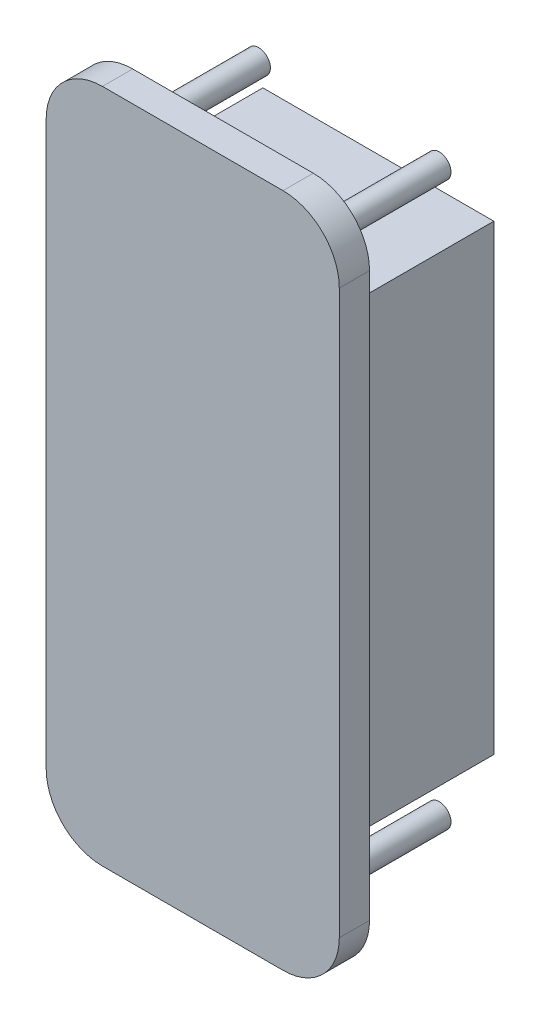
ISO-10303-21;
HEADER;
FILE_DESCRIPTION(('STEP AP214'),'2;1');
FILE_NAME('part.step','',(''),(''),'','','');
FILE_SCHEMA(('AUTOMOTIVE_DESIGN { 1 0 10303 214 1 1 1 1 }'));
ENDSEC;
DATA;
#1=APPLICATION_CONTEXT('core data for automotive mechanical design processes');
#2=APPLICATION_PROTOCOL_DEFINITION('international standard','automotive_design',2000,#1);
#3=PRODUCT_CONTEXT('',#1,'mechanical');
#4=PRODUCT('Part','Part','',(#3));
#5=PRODUCT_RELATED_PRODUCT_CATEGORY('part','',(#4));
#6=PRODUCT_DEFINITION_FORMATION('','',#4);
#7=PRODUCT_DEFINITION_CONTEXT('part definition',#1,'design');
#8=PRODUCT_DEFINITION('design','',#6,#7);
#9=PRODUCT_DEFINITION_SHAPE('','',#8);
#10=(LENGTH_UNIT() NAMED_UNIT(*) SI_UNIT(.MILLI.,.METRE.));
#11=(NAMED_UNIT(*) PLANE_ANGLE_UNIT() SI_UNIT($,.RADIAN.));
#12=(NAMED_UNIT(*) SI_UNIT($,.STERADIAN.) SOLID_ANGLE_UNIT());
#13=UNCERTAINTY_MEASURE_WITH_UNIT(LENGTH_MEASURE(1.E-05),#10,'distance_accuracy_value','');
#14=(GEOMETRIC_REPRESENTATION_CONTEXT(3) GLOBAL_UNCERTAINTY_ASSIGNED_CONTEXT((#13)) GLOBAL_UNIT_ASSIGNED_CONTEXT((#10,
#11,#12)) REPRESENTATION_CONTEXT('',''));
#15=CARTESIAN_POINT('',(0.,0.,0.));
#16=DIRECTION('',(0.,0.,1.));
#17=DIRECTION('',(1.,0.,0.));
#18=AXIS2_PLACEMENT_3D('',#15,#16,#17);
#19=CARTESIAN_POINT('',(-13.7499999999591,-291545.,61.891869381217));
#20=DIRECTION('',(1.,0.,0.));
#21=DIRECTION('',(0.,1.,0.));
#22=AXIS2_PLACEMENT_3D('',#19,#20,#21);
#23=PLANE('',#22);
#24=DIRECTION('',(0.,-1.,0.));
#25=VECTOR('',#24,1.);
#26=CARTESIAN_POINT('',(-13.7499999999591,-291545.,0.399999999999998));
#27=LINE('',#26,#25);
#28=CARTESIAN_POINT('',(-13.7500000000159,27.4999999999686,0.399999999999998));
#29=VERTEX_POINT('',#28);
#30=CARTESIAN_POINT('',(-13.7500000000159,-27.4999999999686,0.399999999999998));
#31=VERTEX_POINT('',#30);
#32=EDGE_CURVE('E227',#29,#31,#27,.T.);
#33=ORIENTED_EDGE('',*,*,#32,.F.);
#34=DIRECTION('',(0.,0.,-1.));
#35=VECTOR('',#34,1.);
#36=CARTESIAN_POINT('',(-13.7500000000159,27.4999999999686,61.891869381217));
#37=LINE('',#36,#35);
#38=CARTESIAN_POINT('',(-13.7500000000159,27.4999999999686,-18.1));
#39=VERTEX_POINT('',#38);
#40=EDGE_CURVE('E49',#29,#39,#37,.T.);
#41=ORIENTED_EDGE('',*,*,#40,.T.);
#42=DIRECTION('',(0.,-1.,0.));
#43=VECTOR('',#42,1.);
#44=CARTESIAN_POINT('',(-13.7499999999591,-291545.,-18.1));
#45=LINE('',#44,#43);
#46=CARTESIAN_POINT('',(-13.7500000000159,-27.4999999999686,-18.1));
#47=VERTEX_POINT('',#46);
#48=EDGE_CURVE('E219',#39,#47,#45,.T.);
#49=ORIENTED_EDGE('',*,*,#48,.T.);
#50=DIRECTION('',(0.,0.,-1.));
#51=VECTOR('',#50,1.);
#52=CARTESIAN_POINT('',(-13.7500000000159,-27.4999999999686,61.891869381217));
#53=LINE('',#52,#51);
#54=EDGE_CURVE('E70',#31,#47,#53,.T.);
#55=ORIENTED_EDGE('',*,*,#54,.F.);
#56=EDGE_LOOP('',(#33,#41,#49,#55));
#57=FACE_BOUND('',#56,.T.);
#58=ADVANCED_FACE('F35',(#57),#23,.F.);
#59=CARTESIAN_POINT('',(-400000.,-27.4999999999181,61.891869381217));
#60=DIRECTION('',(0.,1.,0.));
#61=DIRECTION('',(-1.,0.,0.));
#62=AXIS2_PLACEMENT_3D('',#59,#60,#61);
#63=PLANE('',#62);
#64=DIRECTION('',(1.,0.,0.));
#65=VECTOR('',#64,1.);
#66=CARTESIAN_POINT('',(-400000.,-27.4999999999181,0.399999999999998));
#67=LINE('',#66,#65);
#68=CARTESIAN_POINT('',(13.750000000036,-27.499999999975,0.399999999999998));
#69=VERTEX_POINT('',#68);
#70=EDGE_CURVE('E76',#31,#69,#67,.T.);
#71=ORIENTED_EDGE('',*,*,#70,.F.);
#72=ORIENTED_EDGE('',*,*,#54,.T.);
#73=DIRECTION('',(1.,0.,0.));
#74=VECTOR('',#73,1.);
#75=CARTESIAN_POINT('',(-400000.,-27.4999999999181,-18.1));
#76=LINE('',#75,#74);
#77=CARTESIAN_POINT('',(13.750000000036,-27.499999999975,-18.1));
#78=VERTEX_POINT('',#77);
#79=EDGE_CURVE('E217',#47,#78,#76,.T.);
#80=ORIENTED_EDGE('',*,*,#79,.T.);
#81=DIRECTION('',(0.,0.,-1.));
#82=VECTOR('',#81,1.);
#83=CARTESIAN_POINT('',(13.750000000036,-27.499999999975,61.891869381217));
#84=LINE('',#83,#82);
#85=EDGE_CURVE('E216',#69,#78,#84,.T.);
#86=ORIENTED_EDGE('',*,*,#85,.F.);
#87=EDGE_LOOP('',(#71,#72,#80,#86));
#88=FACE_BOUND('',#87,.T.);
#89=ADVANCED_FACE('F276',(#88),#63,.F.);
#90=CARTESIAN_POINT('',(13.7500000000728,-291545.,61.891869381217));
#91=DIRECTION('',(-1.,0.,0.));
#92=DIRECTION('',(0.,-1.,0.));
#93=AXIS2_PLACEMENT_3D('',#90,#91,#92);
#94=PLANE('',#93);
#95=DIRECTION('',(0.,1.,0.));
#96=VECTOR('',#95,1.);
#97=CARTESIAN_POINT('',(13.7500000000728,-291545.,0.399999999999998));
#98=LINE('',#97,#96);
#99=CARTESIAN_POINT('',(13.7500000000159,27.4999999999686,0.399999999999998));
#100=VERTEX_POINT('',#99);
#101=EDGE_CURVE('E222',#69,#100,#98,.T.);
#102=ORIENTED_EDGE('',*,*,#101,.F.);
#103=ORIENTED_EDGE('',*,*,#85,.T.);
#104=DIRECTION('',(0.,1.,0.));
#105=VECTOR('',#104,1.);
#106=CARTESIAN_POINT('',(13.7500000000728,-291545.,-18.1));
#107=LINE('',#106,#105);
#108=CARTESIAN_POINT('',(13.7500000000159,27.4999999999686,-18.1));
#109=VERTEX_POINT('',#108);
#110=EDGE_CURVE('E214',#78,#109,#107,.T.);
#111=ORIENTED_EDGE('',*,*,#110,.T.);
#112=DIRECTION('',(0.,0.,-1.));
#113=VECTOR('',#112,1.);
#114=CARTESIAN_POINT('',(13.7500000000159,27.4999999999686,61.891869381217));
#115=LINE('',#114,#113);
#116=EDGE_CURVE('E55',#100,#109,#115,.T.);
#117=ORIENTED_EDGE('',*,*,#116,.F.);
#118=EDGE_LOOP('',(#102,#103,#111,#117));
#119=FACE_BOUND('',#118,.T.);
#120=ADVANCED_FACE('F281',(#119),#94,.F.);
#121=CARTESIAN_POINT('',(-400000.,27.4999999999181,61.891869381217));
#122=DIRECTION('',(0.,-1.,0.));
#123=DIRECTION('',(1.,0.,0.));
#124=AXIS2_PLACEMENT_3D('',#121,#122,#123);
#125=PLANE('',#124);
#126=DIRECTION('',(-1.,0.,0.));
#127=VECTOR('',#126,1.);
#128=CARTESIAN_POINT('',(-400000.,27.4999999999181,0.399999999999998));
#129=LINE('',#128,#127);
#130=EDGE_CURVE('E213',#100,#29,#129,.T.);
#131=ORIENTED_EDGE('',*,*,#130,.F.);
#132=ORIENTED_EDGE('',*,*,#116,.T.);
#133=DIRECTION('',(-1.,0.,0.));
#134=VECTOR('',#133,1.);
#135=CARTESIAN_POINT('',(-400000.,27.4999999999181,-18.1));
#136=LINE('',#135,#134);
#137=EDGE_CURVE('E211',#109,#39,#136,.T.);
#138=ORIENTED_EDGE('',*,*,#137,.T.);
#139=ORIENTED_EDGE('',*,*,#40,.F.);
#140=EDGE_LOOP('',(#131,#132,#138,#139));
#141=FACE_BOUND('',#140,.T.);
#142=ADVANCED_FACE('F282',(#141),#125,.F.);
#143=CARTESIAN_POINT('',(0.,0.,-18.1));
#144=DIRECTION('',(0.,0.,1.));
#145=DIRECTION('',(1.,0.,0.));
#146=AXIS2_PLACEMENT_3D('',#143,#144,#145);
#147=PLANE('',#146);
#148=ORIENTED_EDGE('',*,*,#48,.F.);
#149=ORIENTED_EDGE('',*,*,#137,.F.);
#150=ORIENTED_EDGE('',*,*,#110,.F.);
#151=ORIENTED_EDGE('',*,*,#79,.F.);
#152=EDGE_LOOP('',(#148,#149,#150,#151));
#153=FACE_BOUND('',#152,.T.);
#154=ADVANCED_FACE('F248',(#153),#147,.F.);
#155=CARTESIAN_POINT('',(0.,0.,0.4));
#156=DIRECTION('',(0.,0.,1.));
#157=DIRECTION('',(1.,0.,0.));
#158=AXIS2_PLACEMENT_3D('',#155,#156,#157);
#159=PLANE('',#158);
#160=CARTESIAN_POINT('',(-10.75,33.5,0.4));
#161=DIRECTION('',(0.,0.,1.));
#162=DIRECTION('',(1.,0.,0.));
#163=AXIS2_PLACEMENT_3D('',#160,#161,#162);
#164=CIRCLE('',#163,1.4);
#165=CARTESIAN_POINT('',(-12.15,33.5,0.4));
#166=VERTEX_POINT('',#165);
#167=EDGE_CURVE('E11',#166,#166,#164,.F.);
#168=ORIENTED_EDGE('',*,*,#167,.F.);
#169=EDGE_LOOP('',(#168));
#170=FACE_BOUND('',#169,.T.);
#171=CARTESIAN_POINT('',(-10.75,-33.5,0.4));
#172=DIRECTION('',(0.,0.,1.));
#173=DIRECTION('',(1.,0.,0.));
#174=AXIS2_PLACEMENT_3D('',#171,#172,#173);
#175=CIRCLE('',#174,1.4);
#176=CARTESIAN_POINT('',(-12.15,-33.5,0.4));
#177=VERTEX_POINT('',#176);
#178=EDGE_CURVE('E42',#177,#177,#175,.F.);
#179=ORIENTED_EDGE('',*,*,#178,.F.);
#180=EDGE_LOOP('',(#179));
#181=FACE_BOUND('',#180,.T.);
#182=CARTESIAN_POINT('',(10.75,33.5,0.4));
#183=DIRECTION('',(0.,0.,1.));
#184=DIRECTION('',(1.,0.,0.));
#185=AXIS2_PLACEMENT_3D('',#182,#183,#184);
#186=CIRCLE('',#185,1.4);
#187=CARTESIAN_POINT('',(9.35,33.5,0.4));
#188=VERTEX_POINT('',#187);
#189=EDGE_CURVE('E238',#188,#188,#186,.F.);
#190=ORIENTED_EDGE('',*,*,#189,.F.);
#191=EDGE_LOOP('',(#190));
#192=FACE_BOUND('',#191,.T.);
#193=CARTESIAN_POINT('',(10.75,-33.5,0.4));
#194=DIRECTION('',(0.,0.,1.));
#195=DIRECTION('',(1.,0.,0.));
#196=AXIS2_PLACEMENT_3D('',#193,#194,#195);
#197=CIRCLE('',#196,1.4);
#198=CARTESIAN_POINT('',(9.35,-33.5,0.4));
#199=VERTEX_POINT('',#198);
#200=EDGE_CURVE('E225',#199,#199,#197,.F.);
#201=ORIENTED_EDGE('',*,*,#200,.F.);
#202=EDGE_LOOP('',(#201));
#203=FACE_BOUND('',#202,.T.);
#204=DIRECTION('',(1.,0.,0.));
#205=VECTOR('',#204,1.);
#206=CARTESIAN_POINT('',(-400000.,40.1999999998618,0.399999999999998));
#207=LINE('',#206,#205);
#208=CARTESIAN_POINT('',(-10.7500000000335,40.2,0.400000000000025));
#209=VERTEX_POINT('',#208);
#210=CARTESIAN_POINT('',(10.75000000003,40.1999999999909,0.400000000000025));
#211=VERTEX_POINT('',#210);
#212=EDGE_CURVE('E135',#209,#211,#207,.T.);
#213=ORIENTED_EDGE('',*,*,#212,.T.);
#214=CARTESIAN_POINT('',(10.75,33.5,0.399999999999998));
#215=DIRECTION('',(0.,0.,1.));
#216=DIRECTION('',(1.,0.,0.));
#217=AXIS2_PLACEMENT_3D('',#214,#215,#216);
#218=CIRCLE('',#217,6.7);
#219=CARTESIAN_POINT('',(17.45,33.5000000000041,0.400000000000025));
#220=VERTEX_POINT('',#219);
#221=EDGE_CURVE('E196',#220,#211,#218,.T.);
#222=ORIENTED_EDGE('',*,*,#221,.F.);
#223=DIRECTION('',(0.,-1.,0.));
#224=VECTOR('',#223,1.);
#225=CARTESIAN_POINT('',(17.4500000000587,-291545.,0.399999999999998));
#226=LINE('',#225,#224);
#227=CARTESIAN_POINT('',(17.4500000000285,-33.5000000000036,0.400000000000025));
#228=VERTEX_POINT('',#227);
#229=EDGE_CURVE('E193',#220,#228,#226,.T.);
#230=ORIENTED_EDGE('',*,*,#229,.T.);
#231=CARTESIAN_POINT('',(10.75,-33.5,0.399999999999998));
#232=DIRECTION('',(0.,0.,1.));
#233=DIRECTION('',(1.,0.,0.));
#234=AXIS2_PLACEMENT_3D('',#231,#232,#233);
#235=CIRCLE('',#234,6.69999999999999);
#236=CARTESIAN_POINT('',(10.74999999997,-40.2,0.400000000000025));
#237=VERTEX_POINT('',#236);
#238=EDGE_CURVE('E190',#237,#228,#235,.T.);
#239=ORIENTED_EDGE('',*,*,#238,.F.);
#240=DIRECTION('',(-1.,0.,0.));
#241=VECTOR('',#240,1.);
#242=CARTESIAN_POINT('',(-400000.,-40.2000000000891,0.399999999999998));
#243=LINE('',#242,#241);
#244=CARTESIAN_POINT('',(-10.75000000003,-40.19999999996,0.400000000000025));
#245=VERTEX_POINT('',#244);
#246=EDGE_CURVE('E186',#237,#245,#243,.T.);
#247=ORIENTED_EDGE('',*,*,#246,.T.);
#248=CARTESIAN_POINT('',(-10.75,-33.5,0.399999999999998));
#249=DIRECTION('',(0.,0.,1.));
#250=DIRECTION('',(1.,0.,0.));
#251=AXIS2_PLACEMENT_3D('',#248,#249,#250);
#252=CIRCLE('',#251,6.7);
#253=CARTESIAN_POINT('',(-17.45,-33.5000000000041,0.400000000000025));
#254=VERTEX_POINT('',#253);
#255=EDGE_CURVE('E183',#254,#245,#252,.T.);
#256=ORIENTED_EDGE('',*,*,#255,.F.);
#257=DIRECTION('',(0.,1.,0.));
#258=VECTOR('',#257,1.);
#259=CARTESIAN_POINT('',(-17.449999999945,-291545.,0.399999999999998));
#260=LINE('',#259,#258);
#261=CARTESIAN_POINT('',(-17.4499999999752,33.5000000000036,0.400000000000025));
#262=VERTEX_POINT('',#261);
#263=EDGE_CURVE('E138',#254,#262,#260,.T.);
#264=ORIENTED_EDGE('',*,*,#263,.T.);
#265=CARTESIAN_POINT('',(-10.75,33.5,0.399999999999998));
#266=DIRECTION('',(0.,0.,1.));
#267=DIRECTION('',(1.,0.,0.));
#268=AXIS2_PLACEMENT_3D('',#265,#266,#267);
#269=CIRCLE('',#268,6.7);
#270=EDGE_CURVE('E130',#209,#262,#269,.T.);
#271=ORIENTED_EDGE('',*,*,#270,.F.);
#272=EDGE_LOOP('',(#213,#222,#230,#239,#247,#256,#264,#271));
#273=FACE_BOUND('',#272,.T.);
#274=ORIENTED_EDGE('',*,*,#101,.T.);
#275=ORIENTED_EDGE('',*,*,#130,.T.);
#276=ORIENTED_EDGE('',*,*,#32,.T.);
#277=ORIENTED_EDGE('',*,*,#70,.T.);
#278=EDGE_LOOP('',(#274,#275,#276,#277));
#279=FACE_BOUND('',#278,.T.);
#280=ADVANCED_FACE('F132',(#170,#181,#192,#203,#273,#279),#159,.F.);
#281=CARTESIAN_POINT('',(0.,0.,4.));
#282=DIRECTION('',(0.,0.,1.));
#283=DIRECTION('',(1.,0.,0.));
#284=AXIS2_PLACEMENT_3D('',#281,#282,#283);
#285=PLANE('',#284);
#286=DIRECTION('',(1.,0.,0.));
#287=VECTOR('',#286,1.);
#288=CARTESIAN_POINT('',(-400000.,40.1999999998618,4.));
#289=LINE('',#288,#287);
#290=CARTESIAN_POINT('',(-10.7500000000335,40.2,4.00000000000003));
#291=VERTEX_POINT('',#290);
#292=CARTESIAN_POINT('',(10.75000000003,40.1999999999909,4.00000000000003));
#293=VERTEX_POINT('',#292);
#294=EDGE_CURVE('E151',#291,#293,#289,.T.);
#295=ORIENTED_EDGE('',*,*,#294,.F.);
#296=CARTESIAN_POINT('',(-10.75,33.5,4.));
#297=DIRECTION('',(0.,0.,1.));
#298=DIRECTION('',(1.,0.,0.));
#299=AXIS2_PLACEMENT_3D('',#296,#297,#298);
#300=CIRCLE('',#299,6.7);
#301=CARTESIAN_POINT('',(-17.4499999999752,33.5000000000036,4.00000000000003));
#302=VERTEX_POINT('',#301);
#303=EDGE_CURVE('E156',#291,#302,#300,.T.);
#304=ORIENTED_EDGE('',*,*,#303,.T.);
#305=DIRECTION('',(0.,1.,0.));
#306=VECTOR('',#305,1.);
#307=CARTESIAN_POINT('',(-17.449999999945,-291545.,4.));
#308=LINE('',#307,#306);
#309=CARTESIAN_POINT('',(-17.45,-33.5000000000041,4.00000000000003));
#310=VERTEX_POINT('',#309);
#311=EDGE_CURVE('E142',#310,#302,#308,.T.);
#312=ORIENTED_EDGE('',*,*,#311,.F.);
#313=CARTESIAN_POINT('',(-10.75,-33.5,4.));
#314=DIRECTION('',(0.,0.,1.));
#315=DIRECTION('',(1.,0.,0.));
#316=AXIS2_PLACEMENT_3D('',#313,#314,#315);
#317=CIRCLE('',#316,6.7);
#318=CARTESIAN_POINT('',(-10.75000000003,-40.19999999996,4.00000000000003));
#319=VERTEX_POINT('',#318);
#320=EDGE_CURVE('E182',#310,#319,#317,.T.);
#321=ORIENTED_EDGE('',*,*,#320,.T.);
#322=DIRECTION('',(-1.,0.,0.));
#323=VECTOR('',#322,1.);
#324=CARTESIAN_POINT('',(-400000.,-40.2000000000891,4.));
#325=LINE('',#324,#323);
#326=CARTESIAN_POINT('',(10.74999999997,-40.2,4.00000000000003));
#327=VERTEX_POINT('',#326);
#328=EDGE_CURVE('E185',#327,#319,#325,.T.);
#329=ORIENTED_EDGE('',*,*,#328,.F.);
#330=CARTESIAN_POINT('',(10.75,-33.5,4.));
#331=DIRECTION('',(0.,0.,1.));
#332=DIRECTION('',(1.,0.,0.));
#333=AXIS2_PLACEMENT_3D('',#330,#331,#332);
#334=CIRCLE('',#333,6.69999999999999);
#335=CARTESIAN_POINT('',(17.4500000000285,-33.5000000000036,4.00000000000003));
#336=VERTEX_POINT('',#335);
#337=EDGE_CURVE('E189',#327,#336,#334,.T.);
#338=ORIENTED_EDGE('',*,*,#337,.T.);
#339=DIRECTION('',(0.,-1.,0.));
#340=VECTOR('',#339,1.);
#341=CARTESIAN_POINT('',(17.4500000000587,-291545.,4.));
#342=LINE('',#341,#340);
#343=CARTESIAN_POINT('',(17.45,33.5000000000041,4.00000000000003));
#344=VERTEX_POINT('',#343);
#345=EDGE_CURVE('E192',#344,#336,#342,.T.);
#346=ORIENTED_EDGE('',*,*,#345,.F.);
#347=CARTESIAN_POINT('',(10.75,33.5,4.));
#348=DIRECTION('',(0.,0.,1.));
#349=DIRECTION('',(1.,0.,0.));
#350=AXIS2_PLACEMENT_3D('',#347,#348,#349);
#351=CIRCLE('',#350,6.7);
#352=EDGE_CURVE('E150',#344,#293,#351,.T.);
#353=ORIENTED_EDGE('',*,*,#352,.T.);
#354=EDGE_LOOP('',(#295,#304,#312,#321,#329,#338,#346,#353));
#355=FACE_BOUND('',#354,.T.);
#356=ADVANCED_FACE('F247',(#355),#285,.T.);
#357=CARTESIAN_POINT('',(10.75,33.5,89.8093817714701));
#358=DIRECTION('',(0.,0.,-1.));
#359=DIRECTION('',(-1.,0.,0.));
#360=AXIS2_PLACEMENT_3D('',#357,#358,#359);
#361=CYLINDRICAL_SURFACE('',#360,6.7);
#362=ORIENTED_EDGE('',*,*,#352,.F.);
#363=DIRECTION('',(0.,0.,-1.));
#364=VECTOR('',#363,1.);
#365=CARTESIAN_POINT('',(17.45,33.5000000000041,89.8093817714701));
#366=LINE('',#365,#364);
#367=EDGE_CURVE('E166',#344,#220,#366,.T.);
#368=ORIENTED_EDGE('',*,*,#367,.T.);
#369=ORIENTED_EDGE('',*,*,#221,.T.);
#370=DIRECTION('',(0.,0.,1.));
#371=VECTOR('',#370,1.);
#372=CARTESIAN_POINT('',(10.75000000003,40.1999999999909,89.8093817714701));
#373=LINE('',#372,#371);
#374=EDGE_CURVE('E149',#293,#211,#373,.F.);
#375=ORIENTED_EDGE('',*,*,#374,.F.);
#376=EDGE_LOOP('',(#362,#368,#369,#375));
#377=FACE_BOUND('',#376,.T.);
#378=ADVANCED_FACE('F260',(#377),#361,.T.);
#379=CARTESIAN_POINT('',(17.4500000000587,-291545.,89.8093817714701));
#380=DIRECTION('',(1.,0.,0.));
#381=DIRECTION('',(0.,1.,0.));
#382=AXIS2_PLACEMENT_3D('',#379,#380,#381);
#383=PLANE('',#382);
#384=ORIENTED_EDGE('',*,*,#367,.F.);
#385=ORIENTED_EDGE('',*,*,#345,.T.);
#386=DIRECTION('',(0.,0.,1.));
#387=VECTOR('',#386,1.);
#388=CARTESIAN_POINT('',(17.4500000000285,-33.5000000000036,89.8093817714701));
#389=LINE('',#388,#387);
#390=EDGE_CURVE('E169',#336,#228,#389,.F.);
#391=ORIENTED_EDGE('',*,*,#390,.T.);
#392=ORIENTED_EDGE('',*,*,#229,.F.);
#393=EDGE_LOOP('',(#384,#385,#391,#392));
#394=FACE_BOUND('',#393,.T.);
#395=ADVANCED_FACE('F272',(#394),#383,.T.);
#396=CARTESIAN_POINT('',(10.75,-33.5,89.8093817714701));
#397=DIRECTION('',(0.,0.,-1.));
#398=DIRECTION('',(-1.,0.,0.));
#399=AXIS2_PLACEMENT_3D('',#396,#397,#398);
#400=CYLINDRICAL_SURFACE('',#399,6.69999999999999);
#401=ORIENTED_EDGE('',*,*,#337,.F.);
#402=DIRECTION('',(0.,0.,-1.));
#403=VECTOR('',#402,1.);
#404=CARTESIAN_POINT('',(10.74999999997,-40.2,89.8093817714701));
#405=LINE('',#404,#403);
#406=EDGE_CURVE('E172',#327,#237,#405,.T.);
#407=ORIENTED_EDGE('',*,*,#406,.T.);
#408=ORIENTED_EDGE('',*,*,#238,.T.);
#409=ORIENTED_EDGE('',*,*,#390,.F.);
#410=EDGE_LOOP('',(#401,#407,#408,#409));
#411=FACE_BOUND('',#410,.T.);
#412=ADVANCED_FACE('F348',(#411),#400,.T.);
#413=CARTESIAN_POINT('',(-400000.,-40.2000000000891,89.8093817714701));
#414=DIRECTION('',(0.,-1.,0.));
#415=DIRECTION('',(1.,0.,0.));
#416=AXIS2_PLACEMENT_3D('',#413,#414,#415);
#417=PLANE('',#416);
#418=ORIENTED_EDGE('',*,*,#406,.F.);
#419=ORIENTED_EDGE('',*,*,#328,.T.);
#420=DIRECTION('',(0.,0.,1.));
#421=VECTOR('',#420,1.);
#422=CARTESIAN_POINT('',(-10.75000000003,-40.19999999996,89.8093817714701));
#423=LINE('',#422,#421);
#424=EDGE_CURVE('E175',#319,#245,#423,.F.);
#425=ORIENTED_EDGE('',*,*,#424,.T.);
#426=ORIENTED_EDGE('',*,*,#246,.F.);
#427=EDGE_LOOP('',(#418,#419,#425,#426));
#428=FACE_BOUND('',#427,.T.);
#429=ADVANCED_FACE('F359',(#428),#417,.T.);
#430=CARTESIAN_POINT('',(-10.75,-33.5,89.8093817714701));
#431=DIRECTION('',(0.,0.,-1.));
#432=DIRECTION('',(-1.,0.,0.));
#433=AXIS2_PLACEMENT_3D('',#430,#431,#432);
#434=CYLINDRICAL_SURFACE('',#433,6.7);
#435=ORIENTED_EDGE('',*,*,#320,.F.);
#436=DIRECTION('',(0.,0.,-1.));
#437=VECTOR('',#436,1.);
#438=CARTESIAN_POINT('',(-17.45,-33.5000000000041,89.8093817714701));
#439=LINE('',#438,#437);
#440=EDGE_CURVE('E159',#310,#254,#439,.T.);
#441=ORIENTED_EDGE('',*,*,#440,.T.);
#442=ORIENTED_EDGE('',*,*,#255,.T.);
#443=ORIENTED_EDGE('',*,*,#424,.F.);
#444=EDGE_LOOP('',(#435,#441,#442,#443));
#445=FACE_BOUND('',#444,.T.);
#446=ADVANCED_FACE('F370',(#445),#434,.T.);
#447=CARTESIAN_POINT('',(-17.449999999945,-291545.,89.8093817714701));
#448=DIRECTION('',(-1.,0.,0.));
#449=DIRECTION('',(0.,-1.,0.));
#450=AXIS2_PLACEMENT_3D('',#447,#448,#449);
#451=PLANE('',#450);
#452=ORIENTED_EDGE('',*,*,#440,.F.);
#453=ORIENTED_EDGE('',*,*,#311,.T.);
#454=DIRECTION('',(0.,0.,1.));
#455=VECTOR('',#454,1.);
#456=CARTESIAN_POINT('',(-17.4499999999752,33.5000000000036,89.8093817714701));
#457=LINE('',#456,#455);
#458=EDGE_CURVE('E157',#302,#262,#457,.F.);
#459=ORIENTED_EDGE('',*,*,#458,.T.);
#460=ORIENTED_EDGE('',*,*,#263,.F.);
#461=EDGE_LOOP('',(#452,#453,#459,#460));
#462=FACE_BOUND('',#461,.T.);
#463=ADVANCED_FACE('F381',(#462),#451,.T.);
#464=CARTESIAN_POINT('',(-400000.,40.1999999998618,89.8093817714701));
#465=DIRECTION('',(0.,1.,0.));
#466=DIRECTION('',(-1.,0.,0.));
#467=AXIS2_PLACEMENT_3D('',#464,#465,#466);
#468=PLANE('',#467);
#469=DIRECTION('',(0.,0.,-1.));
#470=VECTOR('',#469,1.);
#471=CARTESIAN_POINT('',(-10.7500000000335,40.2,89.8093817714701));
#472=LINE('',#471,#470);
#473=EDGE_CURVE('E143',#291,#209,#472,.T.);
#474=ORIENTED_EDGE('',*,*,#473,.F.);
#475=ORIENTED_EDGE('',*,*,#294,.T.);
#476=ORIENTED_EDGE('',*,*,#374,.T.);
#477=ORIENTED_EDGE('',*,*,#212,.F.);
#478=EDGE_LOOP('',(#474,#475,#476,#477));
#479=FACE_BOUND('',#478,.T.);
#480=ADVANCED_FACE('F146',(#479),#468,.T.);
#481=CARTESIAN_POINT('',(-10.75,33.5,89.8093817714701));
#482=DIRECTION('',(0.,0.,-1.));
#483=DIRECTION('',(-1.,0.,0.));
#484=AXIS2_PLACEMENT_3D('',#481,#482,#483);
#485=CYLINDRICAL_SURFACE('',#484,6.7);
#486=ORIENTED_EDGE('',*,*,#303,.F.);
#487=ORIENTED_EDGE('',*,*,#473,.T.);
#488=ORIENTED_EDGE('',*,*,#270,.T.);
#489=ORIENTED_EDGE('',*,*,#458,.F.);
#490=EDGE_LOOP('',(#486,#487,#488,#489));
#491=FACE_BOUND('',#490,.T.);
#492=ADVANCED_FACE('F154',(#491),#485,.T.);
#493=CARTESIAN_POINT('',(10.75,-33.5,4.35979797464466));
#494=DIRECTION('',(0.,0.,-1.));
#495=DIRECTION('',(-1.,0.,0.));
#496=AXIS2_PLACEMENT_3D('',#493,#494,#495);
#497=CYLINDRICAL_SURFACE('',#496,1.4);
#498=CARTESIAN_POINT('',(10.75,-33.5,-14.6));
#499=DIRECTION('',(0.,0.,1.));
#500=DIRECTION('',(1.,0.,0.));
#501=AXIS2_PLACEMENT_3D('',#498,#499,#500);
#502=CIRCLE('',#501,1.4);
#503=CARTESIAN_POINT('',(9.35,-33.5,-14.6));
#504=VERTEX_POINT('',#503);
#505=EDGE_CURVE('E163',#504,#504,#502,.T.);
#506=CARTESIAN_POINT('',(9.35,-33.5,-14.6));
#507=CARTESIAN_POINT('',(9.35,-33.5,-14.44375));
#508=CARTESIAN_POINT('',(9.35,-33.5,-14.2875));
#509=CARTESIAN_POINT('',(9.35,-33.5,-13.975));
#510=CARTESIAN_POINT('',(9.35,-33.5,-13.81875));
#511=CARTESIAN_POINT('',(9.35,-33.5,-13.50625));
#512=CARTESIAN_POINT('',(9.35,-33.5,-13.35));
#513=CARTESIAN_POINT('',(9.35,-33.5,-13.0375));
#514=CARTESIAN_POINT('',(9.35,-33.5,-12.88125));
#515=CARTESIAN_POINT('',(9.35,-33.5,-12.56875));
#516=CARTESIAN_POINT('',(9.35,-33.5,-12.4125));
#517=CARTESIAN_POINT('',(9.35,-33.5,-12.1));
#518=CARTESIAN_POINT('',(9.35,-33.5,-11.94375));
#519=CARTESIAN_POINT('',(9.35,-33.5,-11.63125));
#520=CARTESIAN_POINT('',(9.35,-33.5,-11.475));
#521=CARTESIAN_POINT('',(9.35,-33.5,-11.1625));
#522=CARTESIAN_POINT('',(9.35,-33.5,-11.00625));
#523=CARTESIAN_POINT('',(9.35,-33.5,-10.69375));
#524=CARTESIAN_POINT('',(9.35,-33.5,-10.5375));
#525=CARTESIAN_POINT('',(9.35,-33.5,-10.225));
#526=CARTESIAN_POINT('',(9.35,-33.5,-10.06875));
#527=CARTESIAN_POINT('',(9.35,-33.5,-9.75625));
#528=CARTESIAN_POINT('',(9.35,-33.5,-9.6));
#529=CARTESIAN_POINT('',(9.35,-33.5,-9.2875));
#530=CARTESIAN_POINT('',(9.35,-33.5,-9.13125));
#531=CARTESIAN_POINT('',(9.35,-33.5,-8.81875));
#532=CARTESIAN_POINT('',(9.35,-33.5,-8.6625));
#533=CARTESIAN_POINT('',(9.35,-33.5,-8.35));
#534=CARTESIAN_POINT('',(9.35,-33.5,-8.19375));
#535=CARTESIAN_POINT('',(9.35,-33.5,-7.88125));
#536=CARTESIAN_POINT('',(9.35,-33.5,-7.725));
#537=CARTESIAN_POINT('',(9.35,-33.5,-7.4125));
#538=CARTESIAN_POINT('',(9.35,-33.5,-7.25625));
#539=CARTESIAN_POINT('',(9.35,-33.5,-6.94375));
#540=CARTESIAN_POINT('',(9.35,-33.5,-6.7875));
#541=CARTESIAN_POINT('',(9.35,-33.5,-6.475));
#542=CARTESIAN_POINT('',(9.35,-33.5,-6.31875));
#543=CARTESIAN_POINT('',(9.35,-33.5,-6.00625));
#544=CARTESIAN_POINT('',(9.35,-33.5,-5.85));
#545=CARTESIAN_POINT('',(9.35,-33.5,-5.5375));
#546=CARTESIAN_POINT('',(9.35,-33.5,-5.38125));
#547=CARTESIAN_POINT('',(9.35,-33.5,-5.06875));
#548=CARTESIAN_POINT('',(9.35,-33.5,-4.9125));
#549=CARTESIAN_POINT('',(9.35,-33.5,-4.6));
#550=CARTESIAN_POINT('',(9.35,-33.5,-4.44375));
#551=CARTESIAN_POINT('',(9.35,-33.5,-4.13125));
#552=CARTESIAN_POINT('',(9.35,-33.5,-3.975));
#553=CARTESIAN_POINT('',(9.35,-33.5,-3.6625));
#554=CARTESIAN_POINT('',(9.35,-33.5,-3.50625));
#555=CARTESIAN_POINT('',(9.35,-33.5,-3.19375));
#556=CARTESIAN_POINT('',(9.35,-33.5,-3.0375));
#557=CARTESIAN_POINT('',(9.35,-33.5,-2.725));
#558=CARTESIAN_POINT('',(9.35,-33.5,-2.56875));
#559=CARTESIAN_POINT('',(9.35,-33.5,-2.25625));
#560=CARTESIAN_POINT('',(9.35,-33.5,-2.1));
#561=CARTESIAN_POINT('',(9.35,-33.5,-1.7875));
#562=CARTESIAN_POINT('',(9.35,-33.5,-1.63125));
#563=CARTESIAN_POINT('',(9.35,-33.5,-1.31875));
#564=CARTESIAN_POINT('',(9.35,-33.5,-1.1625));
#565=CARTESIAN_POINT('',(9.35,-33.5,-0.850000000000001));
#566=CARTESIAN_POINT('',(9.35,-33.5,-0.693750000000001));
#567=CARTESIAN_POINT('',(9.35,-33.5,-0.381250000000001));
#568=CARTESIAN_POINT('',(9.35,-33.5,-0.225));
#569=CARTESIAN_POINT('',(9.35,-33.5,0.0874999999999998));
#570=CARTESIAN_POINT('',(9.35,-33.5,0.24375));
#571=CARTESIAN_POINT('',(9.35,-33.5,0.4));
#572=B_SPLINE_CURVE_WITH_KNOTS('',3,(#506,#507,#508,#509,#510,#511,#512,#513,#514,#515,#516,
#517,#518,#519,#520,#521,#522,#523,#524,#525,#526,#527,#528,#529,#530,#531,#532,#533,#534,#535,
#536,#537,#538,#539,#540,#541,#542,#543,#544,#545,#546,#547,#548,#549,#550,#551,#552,#553,#554,
#555,#556,#557,#558,#559,#560,#561,#562,#563,#564,#565,#566,#567,#568,#569,#570,#571),
.UNSPECIFIED.,.F.,.F.,(4,2,2,2,2,2,2,2,2,2,2,2,2,2,2,2,2,2,2,2,2,2,2,2,2,2,2,2,2,2,2,2,4),(0.,
0.46875,0.937500000000001,1.40625,1.875,2.34375,2.8125,3.28125,3.75,4.21875,4.6875,5.15625,
5.625,6.09375,6.5625,7.03125,7.5,7.96875,8.4375,8.90625,9.375,9.84375,10.3125,10.78125,11.25,
11.71875,12.1875,12.65625,13.125,13.59375,14.0625,14.53125,15.),.UNSPECIFIED.);
#573=EDGE_CURVE('BSEAM255',#504,#199,#572,.T.);
#574=ORIENTED_EDGE('',*,*,#505,.T.);
#575=ORIENTED_EDGE('',*,*,#200,.T.);
#576=ORIENTED_EDGE('',*,*,#573,.T.);
#577=ORIENTED_EDGE('',*,*,#573,.F.);
#578=EDGE_LOOP('',(#574,#576,#575,#577));
#579=FACE_BOUND('',#578,.T.);
#580=ADVANCED_FACE('F255',(#579),#497,.T.);
#581=CARTESIAN_POINT('',(10.75,-33.5,-14.6));
#582=DIRECTION('',(0.,0.,1.));
#583=DIRECTION('',(1.,0.,0.));
#584=AXIS2_PLACEMENT_3D('',#581,#582,#583);
#585=PLANE('',#584);
#586=ORIENTED_EDGE('',*,*,#505,.F.);
#587=EDGE_LOOP('',(#586));
#588=FACE_BOUND('',#587,.T.);
#589=ADVANCED_FACE('F257',(#588),#585,.F.);
#590=CARTESIAN_POINT('',(10.75,33.5,4.35979797464466));
#591=DIRECTION('',(0.,0.,-1.));
#592=DIRECTION('',(-1.,0.,0.));
#593=AXIS2_PLACEMENT_3D('',#590,#591,#592);
#594=CYLINDRICAL_SURFACE('',#593,1.4);
#595=CARTESIAN_POINT('',(10.75,33.5,-14.6));
#596=DIRECTION('',(0.,0.,1.));
#597=DIRECTION('',(1.,0.,0.));
#598=AXIS2_PLACEMENT_3D('',#595,#596,#597);
#599=CIRCLE('',#598,1.4);
#600=CARTESIAN_POINT('',(9.35,33.5,-14.6));
#601=VERTEX_POINT('',#600);
#602=EDGE_CURVE('E483',#601,#601,#599,.T.);
#603=CARTESIAN_POINT('',(9.35,33.5,-14.6));
#604=CARTESIAN_POINT('',(9.35,33.5,-14.44375));
#605=CARTESIAN_POINT('',(9.35,33.5,-14.2875));
#606=CARTESIAN_POINT('',(9.35,33.5,-13.975));
#607=CARTESIAN_POINT('',(9.35,33.5,-13.81875));
#608=CARTESIAN_POINT('',(9.35,33.5,-13.50625));
#609=CARTESIAN_POINT('',(9.35,33.5,-13.35));
#610=CARTESIAN_POINT('',(9.35,33.5,-13.0375));
#611=CARTESIAN_POINT('',(9.35,33.5,-12.88125));
#612=CARTESIAN_POINT('',(9.35,33.5,-12.56875));
#613=CARTESIAN_POINT('',(9.35,33.5,-12.4125));
#614=CARTESIAN_POINT('',(9.35,33.5,-12.1));
#615=CARTESIAN_POINT('',(9.35,33.5,-11.94375));
#616=CARTESIAN_POINT('',(9.35,33.5,-11.63125));
#617=CARTESIAN_POINT('',(9.35,33.5,-11.475));
#618=CARTESIAN_POINT('',(9.35,33.5,-11.1625));
#619=CARTESIAN_POINT('',(9.35,33.5,-11.00625));
#620=CARTESIAN_POINT('',(9.35,33.5,-10.69375));
#621=CARTESIAN_POINT('',(9.35,33.5,-10.5375));
#622=CARTESIAN_POINT('',(9.35,33.5,-10.225));
#623=CARTESIAN_POINT('',(9.35,33.5,-10.06875));
#624=CARTESIAN_POINT('',(9.35,33.5,-9.75625));
#625=CARTESIAN_POINT('',(9.35,33.5,-9.6));
#626=CARTESIAN_POINT('',(9.35,33.5,-9.2875));
#627=CARTESIAN_POINT('',(9.35,33.5,-9.13125));
#628=CARTESIAN_POINT('',(9.35,33.5,-8.81875));
#629=CARTESIAN_POINT('',(9.35,33.5,-8.6625));
#630=CARTESIAN_POINT('',(9.35,33.5,-8.35));
#631=CARTESIAN_POINT('',(9.35,33.5,-8.19375));
#632=CARTESIAN_POINT('',(9.35,33.5,-7.88125));
#633=CARTESIAN_POINT('',(9.35,33.5,-7.725));
#634=CARTESIAN_POINT('',(9.35,33.5,-7.4125));
#635=CARTESIAN_POINT('',(9.35,33.5,-7.25625));
#636=CARTESIAN_POINT('',(9.35,33.5,-6.94375));
#637=CARTESIAN_POINT('',(9.35,33.5,-6.7875));
#638=CARTESIAN_POINT('',(9.35,33.5,-6.475));
#639=CARTESIAN_POINT('',(9.35,33.5,-6.31875));
#640=CARTESIAN_POINT('',(9.35,33.5,-6.00625));
#641=CARTESIAN_POINT('',(9.35,33.5,-5.85));
#642=CARTESIAN_POINT('',(9.35,33.5,-5.5375));
#643=CARTESIAN_POINT('',(9.35,33.5,-5.38125));
#644=CARTESIAN_POINT('',(9.35,33.5,-5.06875));
#645=CARTESIAN_POINT('',(9.35,33.5,-4.9125));
#646=CARTESIAN_POINT('',(9.35,33.5,-4.6));
#647=CARTESIAN_POINT('',(9.35,33.5,-4.44375));
#648=CARTESIAN_POINT('',(9.35,33.5,-4.13125));
#649=CARTESIAN_POINT('',(9.35,33.5,-3.975));
#650=CARTESIAN_POINT('',(9.35,33.5,-3.6625));
#651=CARTESIAN_POINT('',(9.35,33.5,-3.50625));
#652=CARTESIAN_POINT('',(9.35,33.5,-3.19375));
#653=CARTESIAN_POINT('',(9.35,33.5,-3.0375));
#654=CARTESIAN_POINT('',(9.35,33.5,-2.725));
#655=CARTESIAN_POINT('',(9.35,33.5,-2.56875));
#656=CARTESIAN_POINT('',(9.35,33.5,-2.25625));
#657=CARTESIAN_POINT('',(9.35,33.5,-2.1));
#658=CARTESIAN_POINT('',(9.35,33.5,-1.7875));
#659=CARTESIAN_POINT('',(9.35,33.5,-1.63125));
#660=CARTESIAN_POINT('',(9.35,33.5,-1.31875));
#661=CARTESIAN_POINT('',(9.35,33.5,-1.1625));
#662=CARTESIAN_POINT('',(9.35,33.5,-0.850000000000001));
#663=CARTESIAN_POINT('',(9.35,33.5,-0.693750000000001));
#664=CARTESIAN_POINT('',(9.35,33.5,-0.381250000000001));
#665=CARTESIAN_POINT('',(9.35,33.5,-0.225));
#666=CARTESIAN_POINT('',(9.35,33.5,0.0874999999999998));
#667=CARTESIAN_POINT('',(9.35,33.5,0.24375));
#668=CARTESIAN_POINT('',(9.35,33.5,0.4));
#669=B_SPLINE_CURVE_WITH_KNOTS('',3,(#603,#604,#605,#606,#607,#608,#609,#610,#611,#612,#613,
#614,#615,#616,#617,#618,#619,#620,#621,#622,#623,#624,#625,#626,#627,#628,#629,#630,#631,#632,
#633,#634,#635,#636,#637,#638,#639,#640,#641,#642,#643,#644,#645,#646,#647,#648,#649,#650,#651,
#652,#653,#654,#655,#656,#657,#658,#659,#660,#661,#662,#663,#664,#665,#666,#667,#668),
.UNSPECIFIED.,.F.,.F.,(4,2,2,2,2,2,2,2,2,2,2,2,2,2,2,2,2,2,2,2,2,2,2,2,2,2,2,2,2,2,2,2,4),(0.,
0.46875,0.937500000000001,1.40625,1.875,2.34375,2.8125,3.28125,3.75,4.21875,4.6875,5.15625,
5.625,6.09375,6.5625,7.03125,7.5,7.96875,8.4375,8.90625,9.375,9.84375,10.3125,10.78125,11.25,
11.71875,12.1875,12.65625,13.125,13.59375,14.0625,14.53125,15.),.UNSPECIFIED.);
#670=EDGE_CURVE('BSEAM265',#601,#188,#669,.T.);
#671=ORIENTED_EDGE('',*,*,#602,.T.);
#672=ORIENTED_EDGE('',*,*,#189,.T.);
#673=ORIENTED_EDGE('',*,*,#670,.T.);
#674=ORIENTED_EDGE('',*,*,#670,.F.);
#675=EDGE_LOOP('',(#671,#673,#672,#674));
#676=FACE_BOUND('',#675,.T.);
#677=ADVANCED_FACE('F265',(#676),#594,.T.);
#678=CARTESIAN_POINT('',(10.75,33.5,-14.6));
#679=DIRECTION('',(0.,0.,1.));
#680=DIRECTION('',(1.,0.,0.));
#681=AXIS2_PLACEMENT_3D('',#678,#679,#680);
#682=PLANE('',#681);
#683=ORIENTED_EDGE('',*,*,#602,.F.);
#684=EDGE_LOOP('',(#683));
#685=FACE_BOUND('',#684,.T.);
#686=ADVANCED_FACE('F425',(#685),#682,.F.);
#687=CARTESIAN_POINT('',(-10.75,-33.5,4.35979797464466));
#688=DIRECTION('',(0.,0.,-1.));
#689=DIRECTION('',(-1.,0.,0.));
#690=AXIS2_PLACEMENT_3D('',#687,#688,#689);
#691=CYLINDRICAL_SURFACE('',#690,1.4);
#692=CARTESIAN_POINT('',(-10.75,-33.5,-14.6));
#693=DIRECTION('',(0.,0.,1.));
#694=DIRECTION('',(1.,0.,0.));
#695=AXIS2_PLACEMENT_3D('',#692,#693,#694);
#696=CIRCLE('',#695,1.4);
#697=CARTESIAN_POINT('',(-12.15,-33.5,-14.6));
#698=VERTEX_POINT('',#697);
#699=EDGE_CURVE('E480',#698,#698,#696,.T.);
#700=CARTESIAN_POINT('',(-12.15,-33.5,-14.6));
#701=CARTESIAN_POINT('',(-12.15,-33.5,-14.44375));
#702=CARTESIAN_POINT('',(-12.15,-33.5,-14.2875));
#703=CARTESIAN_POINT('',(-12.15,-33.5,-13.975));
#704=CARTESIAN_POINT('',(-12.15,-33.5,-13.81875));
#705=CARTESIAN_POINT('',(-12.15,-33.5,-13.50625));
#706=CARTESIAN_POINT('',(-12.15,-33.5,-13.35));
#707=CARTESIAN_POINT('',(-12.15,-33.5,-13.0375));
#708=CARTESIAN_POINT('',(-12.15,-33.5,-12.88125));
#709=CARTESIAN_POINT('',(-12.15,-33.5,-12.56875));
#710=CARTESIAN_POINT('',(-12.15,-33.5,-12.4125));
#711=CARTESIAN_POINT('',(-12.15,-33.5,-12.1));
#712=CARTESIAN_POINT('',(-12.15,-33.5,-11.94375));
#713=CARTESIAN_POINT('',(-12.15,-33.5,-11.63125));
#714=CARTESIAN_POINT('',(-12.15,-33.5,-11.475));
#715=CARTESIAN_POINT('',(-12.15,-33.5,-11.1625));
#716=CARTESIAN_POINT('',(-12.15,-33.5,-11.00625));
#717=CARTESIAN_POINT('',(-12.15,-33.5,-10.69375));
#718=CARTESIAN_POINT('',(-12.15,-33.5,-10.5375));
#719=CARTESIAN_POINT('',(-12.15,-33.5,-10.225));
#720=CARTESIAN_POINT('',(-12.15,-33.5,-10.06875));
#721=CARTESIAN_POINT('',(-12.15,-33.5,-9.75625));
#722=CARTESIAN_POINT('',(-12.15,-33.5,-9.6));
#723=CARTESIAN_POINT('',(-12.15,-33.5,-9.2875));
#724=CARTESIAN_POINT('',(-12.15,-33.5,-9.13125));
#725=CARTESIAN_POINT('',(-12.15,-33.5,-8.81875));
#726=CARTESIAN_POINT('',(-12.15,-33.5,-8.6625));
#727=CARTESIAN_POINT('',(-12.15,-33.5,-8.35));
#728=CARTESIAN_POINT('',(-12.15,-33.5,-8.19375));
#729=CARTESIAN_POINT('',(-12.15,-33.5,-7.88125));
#730=CARTESIAN_POINT('',(-12.15,-33.5,-7.725));
#731=CARTESIAN_POINT('',(-12.15,-33.5,-7.4125));
#732=CARTESIAN_POINT('',(-12.15,-33.5,-7.25625));
#733=CARTESIAN_POINT('',(-12.15,-33.5,-6.94375));
#734=CARTESIAN_POINT('',(-12.15,-33.5,-6.7875));
#735=CARTESIAN_POINT('',(-12.15,-33.5,-6.475));
#736=CARTESIAN_POINT('',(-12.15,-33.5,-6.31875));
#737=CARTESIAN_POINT('',(-12.15,-33.5,-6.00625));
#738=CARTESIAN_POINT('',(-12.15,-33.5,-5.85));
#739=CARTESIAN_POINT('',(-12.15,-33.5,-5.5375));
#740=CARTESIAN_POINT('',(-12.15,-33.5,-5.38125));
#741=CARTESIAN_POINT('',(-12.15,-33.5,-5.06875));
#742=CARTESIAN_POINT('',(-12.15,-33.5,-4.9125));
#743=CARTESIAN_POINT('',(-12.15,-33.5,-4.6));
#744=CARTESIAN_POINT('',(-12.15,-33.5,-4.44375));
#745=CARTESIAN_POINT('',(-12.15,-33.5,-4.13125));
#746=CARTESIAN_POINT('',(-12.15,-33.5,-3.975));
#747=CARTESIAN_POINT('',(-12.15,-33.5,-3.6625));
#748=CARTESIAN_POINT('',(-12.15,-33.5,-3.50625));
#749=CARTESIAN_POINT('',(-12.15,-33.5,-3.19375));
#750=CARTESIAN_POINT('',(-12.15,-33.5,-3.0375));
#751=CARTESIAN_POINT('',(-12.15,-33.5,-2.725));
#752=CARTESIAN_POINT('',(-12.15,-33.5,-2.56875));
#753=CARTESIAN_POINT('',(-12.15,-33.5,-2.25625));
#754=CARTESIAN_POINT('',(-12.15,-33.5,-2.1));
#755=CARTESIAN_POINT('',(-12.15,-33.5,-1.7875));
#756=CARTESIAN_POINT('',(-12.15,-33.5,-1.63125));
#757=CARTESIAN_POINT('',(-12.15,-33.5,-1.31875));
#758=CARTESIAN_POINT('',(-12.15,-33.5,-1.1625));
#759=CARTESIAN_POINT('',(-12.15,-33.5,-0.850000000000001));
#760=CARTESIAN_POINT('',(-12.15,-33.5,-0.693750000000001));
#761=CARTESIAN_POINT('',(-12.15,-33.5,-0.381250000000001));
#762=CARTESIAN_POINT('',(-12.15,-33.5,-0.225));
#763=CARTESIAN_POINT('',(-12.15,-33.5,0.0874999999999998));
#764=CARTESIAN_POINT('',(-12.15,-33.5,0.24375));
#765=CARTESIAN_POINT('',(-12.15,-33.5,0.4));
#766=B_SPLINE_CURVE_WITH_KNOTS('',3,(#700,#701,#702,#703,#704,#705,#706,#707,#708,#709,#710,
#711,#712,#713,#714,#715,#716,#717,#718,#719,#720,#721,#722,#723,#724,#725,#726,#727,#728,#729,
#730,#731,#732,#733,#734,#735,#736,#737,#738,#739,#740,#741,#742,#743,#744,#745,#746,#747,#748,
#749,#750,#751,#752,#753,#754,#755,#756,#757,#758,#759,#760,#761,#762,#763,#764,#765),
.UNSPECIFIED.,.F.,.F.,(4,2,2,2,2,2,2,2,2,2,2,2,2,2,2,2,2,2,2,2,2,2,2,2,2,2,2,2,2,2,2,2,4),(0.,
0.46875,0.937500000000001,1.40625,1.875,2.34375,2.8125,3.28125,3.75,4.21875,4.6875,5.15625,
5.625,6.09375,6.5625,7.03125,7.5,7.96875,8.4375,8.90625,9.375,9.84375,10.3125,10.78125,11.25,
11.71875,12.1875,12.65625,13.125,13.59375,14.0625,14.53125,15.),.UNSPECIFIED.);
#767=EDGE_CURVE('BSEAM243',#698,#177,#766,.T.);
#768=ORIENTED_EDGE('',*,*,#699,.T.);
#769=ORIENTED_EDGE('',*,*,#178,.T.);
#770=ORIENTED_EDGE('',*,*,#767,.T.);
#771=ORIENTED_EDGE('',*,*,#767,.F.);
#772=EDGE_LOOP('',(#768,#770,#769,#771));
#773=FACE_BOUND('',#772,.T.);
#774=ADVANCED_FACE('F243',(#773),#691,.T.);
#775=CARTESIAN_POINT('',(-10.75,-33.5,-14.6));
#776=DIRECTION('',(0.,0.,1.));
#777=DIRECTION('',(1.,0.,0.));
#778=AXIS2_PLACEMENT_3D('',#775,#776,#777);
#779=PLANE('',#778);
#780=ORIENTED_EDGE('',*,*,#699,.F.);
#781=EDGE_LOOP('',(#780));
#782=FACE_BOUND('',#781,.T.);
#783=ADVANCED_FACE('F444',(#782),#779,.F.);
#784=CARTESIAN_POINT('',(-10.75,33.5,4.35979797464466));
#785=DIRECTION('',(0.,0.,-1.));
#786=DIRECTION('',(-1.,0.,0.));
#787=AXIS2_PLACEMENT_3D('',#784,#785,#786);
#788=CYLINDRICAL_SURFACE('',#787,1.4);
#789=CARTESIAN_POINT('',(-10.75,33.5,-14.6));
#790=DIRECTION('',(0.,0.,1.));
#791=DIRECTION('',(1.,0.,0.));
#792=AXIS2_PLACEMENT_3D('',#789,#790,#791);
#793=CIRCLE('',#792,1.4);
#794=CARTESIAN_POINT('',(-12.15,33.5,-14.6));
#795=VERTEX_POINT('',#794);
#796=EDGE_CURVE('E479',#795,#795,#793,.T.);
#797=CARTESIAN_POINT('',(-12.15,33.5,-14.6));
#798=CARTESIAN_POINT('',(-12.15,33.5,-14.44375));
#799=CARTESIAN_POINT('',(-12.15,33.5,-14.2875));
#800=CARTESIAN_POINT('',(-12.15,33.5,-13.975));
#801=CARTESIAN_POINT('',(-12.15,33.5,-13.81875));
#802=CARTESIAN_POINT('',(-12.15,33.5,-13.50625));
#803=CARTESIAN_POINT('',(-12.15,33.5,-13.35));
#804=CARTESIAN_POINT('',(-12.15,33.5,-13.0375));
#805=CARTESIAN_POINT('',(-12.15,33.5,-12.88125));
#806=CARTESIAN_POINT('',(-12.15,33.5,-12.56875));
#807=CARTESIAN_POINT('',(-12.15,33.5,-12.4125));
#808=CARTESIAN_POINT('',(-12.15,33.5,-12.1));
#809=CARTESIAN_POINT('',(-12.15,33.5,-11.94375));
#810=CARTESIAN_POINT('',(-12.15,33.5,-11.63125));
#811=CARTESIAN_POINT('',(-12.15,33.5,-11.475));
#812=CARTESIAN_POINT('',(-12.15,33.5,-11.1625));
#813=CARTESIAN_POINT('',(-12.15,33.5,-11.00625));
#814=CARTESIAN_POINT('',(-12.15,33.5,-10.69375));
#815=CARTESIAN_POINT('',(-12.15,33.5,-10.5375));
#816=CARTESIAN_POINT('',(-12.15,33.5,-10.225));
#817=CARTESIAN_POINT('',(-12.15,33.5,-10.06875));
#818=CARTESIAN_POINT('',(-12.15,33.5,-9.75625));
#819=CARTESIAN_POINT('',(-12.15,33.5,-9.6));
#820=CARTESIAN_POINT('',(-12.15,33.5,-9.2875));
#821=CARTESIAN_POINT('',(-12.15,33.5,-9.13125));
#822=CARTESIAN_POINT('',(-12.15,33.5,-8.81875));
#823=CARTESIAN_POINT('',(-12.15,33.5,-8.6625));
#824=CARTESIAN_POINT('',(-12.15,33.5,-8.35));
#825=CARTESIAN_POINT('',(-12.15,33.5,-8.19375));
#826=CARTESIAN_POINT('',(-12.15,33.5,-7.88125));
#827=CARTESIAN_POINT('',(-12.15,33.5,-7.725));
#828=CARTESIAN_POINT('',(-12.15,33.5,-7.4125));
#829=CARTESIAN_POINT('',(-12.15,33.5,-7.25625));
#830=CARTESIAN_POINT('',(-12.15,33.5,-6.94375));
#831=CARTESIAN_POINT('',(-12.15,33.5,-6.7875));
#832=CARTESIAN_POINT('',(-12.15,33.5,-6.475));
#833=CARTESIAN_POINT('',(-12.15,33.5,-6.31875));
#834=CARTESIAN_POINT('',(-12.15,33.5,-6.00625));
#835=CARTESIAN_POINT('',(-12.15,33.5,-5.85));
#836=CARTESIAN_POINT('',(-12.15,33.5,-5.5375));
#837=CARTESIAN_POINT('',(-12.15,33.5,-5.38125));
#838=CARTESIAN_POINT('',(-12.15,33.5,-5.06875));
#839=CARTESIAN_POINT('',(-12.15,33.5,-4.9125));
#840=CARTESIAN_POINT('',(-12.15,33.5,-4.6));
#841=CARTESIAN_POINT('',(-12.15,33.5,-4.44375));
#842=CARTESIAN_POINT('',(-12.15,33.5,-4.13125));
#843=CARTESIAN_POINT('',(-12.15,33.5,-3.975));
#844=CARTESIAN_POINT('',(-12.15,33.5,-3.6625));
#845=CARTESIAN_POINT('',(-12.15,33.5,-3.50625));
#846=CARTESIAN_POINT('',(-12.15,33.5,-3.19375));
#847=CARTESIAN_POINT('',(-12.15,33.5,-3.0375));
#848=CARTESIAN_POINT('',(-12.15,33.5,-2.725));
#849=CARTESIAN_POINT('',(-12.15,33.5,-2.56875));
#850=CARTESIAN_POINT('',(-12.15,33.5,-2.25625));
#851=CARTESIAN_POINT('',(-12.15,33.5,-2.1));
#852=CARTESIAN_POINT('',(-12.15,33.5,-1.7875));
#853=CARTESIAN_POINT('',(-12.15,33.5,-1.63125));
#854=CARTESIAN_POINT('',(-12.15,33.5,-1.31875));
#855=CARTESIAN_POINT('',(-12.15,33.5,-1.1625));
#856=CARTESIAN_POINT('',(-12.15,33.5,-0.850000000000001));
#857=CARTESIAN_POINT('',(-12.15,33.5,-0.693750000000001));
#858=CARTESIAN_POINT('',(-12.15,33.5,-0.381250000000001));
#859=CARTESIAN_POINT('',(-12.15,33.5,-0.225));
#860=CARTESIAN_POINT('',(-12.15,33.5,0.0874999999999998));
#861=CARTESIAN_POINT('',(-12.15,33.5,0.24375));
#862=CARTESIAN_POINT('',(-12.15,33.5,0.4));
#863=B_SPLINE_CURVE_WITH_KNOTS('',3,(#797,#798,#799,#800,#801,#802,#803,#804,#805,#806,#807,
#808,#809,#810,#811,#812,#813,#814,#815,#816,#817,#818,#819,#820,#821,#822,#823,#824,#825,#826,
#827,#828,#829,#830,#831,#832,#833,#834,#835,#836,#837,#838,#839,#840,#841,#842,#843,#844,#845,
#846,#847,#848,#849,#850,#851,#852,#853,#854,#855,#856,#857,#858,#859,#860,#861,#862),
.UNSPECIFIED.,.F.,.F.,(4,2,2,2,2,2,2,2,2,2,2,2,2,2,2,2,2,2,2,2,2,2,2,2,2,2,2,2,2,2,2,2,4),(0.,
0.46875,0.937500000000001,1.40625,1.875,2.34375,2.8125,3.28125,3.75,4.21875,4.6875,5.15625,
5.625,6.09375,6.5625,7.03125,7.5,7.96875,8.4375,8.90625,9.375,9.84375,10.3125,10.78125,11.25,
11.71875,12.1875,12.65625,13.125,13.59375,14.0625,14.53125,15.),.UNSPECIFIED.);
#864=EDGE_CURVE('BSEAM454',#795,#166,#863,.T.);
#865=ORIENTED_EDGE('',*,*,#796,.T.);
#866=ORIENTED_EDGE('',*,*,#167,.T.);
#867=ORIENTED_EDGE('',*,*,#864,.T.);
#868=ORIENTED_EDGE('',*,*,#864,.F.);
#869=EDGE_LOOP('',(#865,#867,#866,#868));
#870=FACE_BOUND('',#869,.T.);
#871=ADVANCED_FACE('F454',(#870),#788,.T.);
#872=CARTESIAN_POINT('',(-10.75,33.5,-14.6));
#873=DIRECTION('',(0.,0.,1.));
#874=DIRECTION('',(1.,0.,0.));
#875=AXIS2_PLACEMENT_3D('',#872,#873,#874);
#876=PLANE('',#875);
#877=ORIENTED_EDGE('',*,*,#796,.F.);
#878=EDGE_LOOP('',(#877));
#879=FACE_BOUND('',#878,.T.);
#880=ADVANCED_FACE('F464',(#879),#876,.F.);
#881=CLOSED_SHELL('',(#58,#89,#120,#142,#154,#280,#356,#378,#395,#412,#429,#446,#463,#480,#492,
#580,#589,#677,#686,#774,#783,#871,#880));
#882=MANIFOLD_SOLID_BREP('B2',#881);
#883=ADVANCED_BREP_SHAPE_REPRESENTATION('',(#18,#882),#14);
#884=SHAPE_DEFINITION_REPRESENTATION(#9,#883);
ENDSEC;
END-ISO-10303-21;
